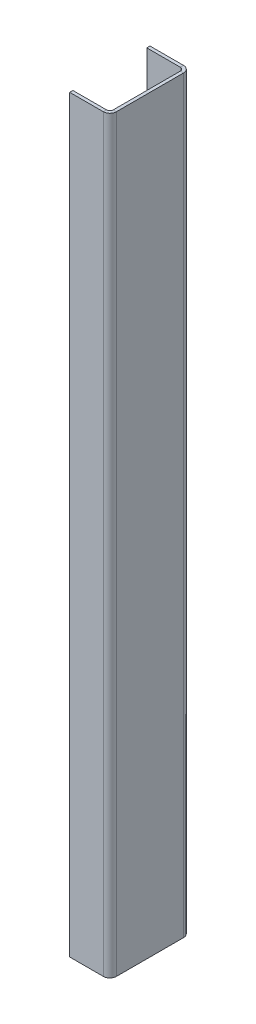
ISO-10303-21;
HEADER;
FILE_DESCRIPTION(('STEP AP214'),'2;1');
FILE_NAME('part.step','',(''),(''),'','','');
FILE_SCHEMA(('AUTOMOTIVE_DESIGN { 1 0 10303 214 1 1 1 1 }'));
ENDSEC;
DATA;
#1=APPLICATION_CONTEXT('core data for automotive mechanical design processes');
#2=APPLICATION_PROTOCOL_DEFINITION('international standard','automotive_design',2000,#1);
#3=PRODUCT_CONTEXT('',#1,'mechanical');
#4=PRODUCT('Part','Part','',(#3));
#5=PRODUCT_RELATED_PRODUCT_CATEGORY('part','',(#4));
#6=PRODUCT_DEFINITION_FORMATION('','',#4);
#7=PRODUCT_DEFINITION_CONTEXT('part definition',#1,'design');
#8=PRODUCT_DEFINITION('design','',#6,#7);
#9=PRODUCT_DEFINITION_SHAPE('','',#8);
#10=(LENGTH_UNIT() NAMED_UNIT(*) SI_UNIT(.MILLI.,.METRE.));
#11=(NAMED_UNIT(*) PLANE_ANGLE_UNIT() SI_UNIT($,.RADIAN.));
#12=(NAMED_UNIT(*) SI_UNIT($,.STERADIAN.) SOLID_ANGLE_UNIT());
#13=UNCERTAINTY_MEASURE_WITH_UNIT(LENGTH_MEASURE(1.E-05),#10,'distance_accuracy_value','');
#14=(GEOMETRIC_REPRESENTATION_CONTEXT(3) GLOBAL_UNCERTAINTY_ASSIGNED_CONTEXT((#13)) GLOBAL_UNIT_ASSIGNED_CONTEXT((#10,
#11,#12)) REPRESENTATION_CONTEXT('',''));
#15=CARTESIAN_POINT('',(0.,0.,0.));
#16=DIRECTION('',(0.,0.,1.));
#17=DIRECTION('',(1.,0.,0.));
#18=AXIS2_PLACEMENT_3D('',#15,#16,#17);
#19=CARTESIAN_POINT('',(0.,355.6,-31.88716));
#20=DIRECTION('',(0.,1.,0.));
#21=DIRECTION('',(0.,0.,1.));
#22=AXIS2_PLACEMENT_3D('',#19,#20,#21);
#23=PLANE('',#22);
#24=DIRECTION('',(-1.,0.,0.));
#25=VECTOR('',#24,1.);
#26=CARTESIAN_POINT('',(0.,355.6,-31.88716));
#27=LINE('',#26,#25);
#28=CARTESIAN_POINT('',(0.,355.6,-31.88716));
#29=VERTEX_POINT('',#28);
#30=CARTESIAN_POINT('',(-3.03784,355.6,-31.88716));
#31=VERTEX_POINT('',#30);
#32=EDGE_CURVE('E11',#29,#31,#27,.T.);
#33=ORIENTED_EDGE('',*,*,#32,.F.);
#34=CARTESIAN_POINT('',(-6.21284000000001,355.6,-31.88716));
#35=DIRECTION('',(0.,1.,0.));
#36=DIRECTION('',(0.,0.,1.));
#37=AXIS2_PLACEMENT_3D('',#34,#35,#36);
#38=CIRCLE('',#37,6.21284);
#39=CARTESIAN_POINT('',(-6.21284000000003,355.6,-38.1));
#40=VERTEX_POINT('',#39);
#41=EDGE_CURVE('E249',#40,#29,#38,.F.);
#42=ORIENTED_EDGE('',*,*,#41,.F.);
#43=DIRECTION('',(0.,0.,-1.));
#44=VECTOR('',#43,1.);
#45=CARTESIAN_POINT('',(-6.21284000000002,355.6,-35.06216));
#46=LINE('',#45,#44);
#47=CARTESIAN_POINT('',(-6.21284000000002,355.6,-35.06216));
#48=VERTEX_POINT('',#47);
#49=EDGE_CURVE('E47',#48,#40,#46,.T.);
#50=ORIENTED_EDGE('',*,*,#49,.F.);
#51=CARTESIAN_POINT('',(-6.21284000000001,355.6,-31.88716));
#52=DIRECTION('',(0.,1.,0.));
#53=DIRECTION('',(1.,0.,0.));
#54=AXIS2_PLACEMENT_3D('',#51,#52,#53);
#55=CIRCLE('',#54,3.175);
#56=EDGE_CURVE('E148',#48,#31,#55,.F.);
#57=ORIENTED_EDGE('',*,*,#56,.T.);
#58=EDGE_LOOP('',(#33,#42,#50,#57));
#59=FACE_BOUND('',#58,.T.);
#60=ADVANCED_FACE('F39',(#59),#23,.T.);
#61=CARTESIAN_POINT('',(-6.21284000000002,355.6,-35.06216));
#62=DIRECTION('',(0.,1.,0.));
#63=DIRECTION('',(0.,0.,1.));
#64=AXIS2_PLACEMENT_3D('',#61,#62,#63);
#65=PLANE('',#64);
#66=DIRECTION('',(0.,0.,1.));
#67=VECTOR('',#66,1.);
#68=CARTESIAN_POINT('',(0.,355.6,-38.1));
#69=LINE('',#68,#67);
#70=CARTESIAN_POINT('',(0.,355.6,31.8871599999999));
#71=VERTEX_POINT('',#70);
#72=EDGE_CURVE('E142',#29,#71,#69,.T.);
#73=ORIENTED_EDGE('',*,*,#72,.F.);
#74=ORIENTED_EDGE('',*,*,#32,.T.);
#75=DIRECTION('',(0.,0.,-1.));
#76=VECTOR('',#75,1.);
#77=CARTESIAN_POINT('',(-3.03784,355.6,-38.1));
#78=LINE('',#77,#76);
#79=CARTESIAN_POINT('',(-3.03784,355.6,31.88716));
#80=VERTEX_POINT('',#79);
#81=EDGE_CURVE('E139',#31,#80,#78,.F.);
#82=ORIENTED_EDGE('',*,*,#81,.T.);
#83=DIRECTION('',(1.,0.,0.));
#84=VECTOR('',#83,1.);
#85=CARTESIAN_POINT('',(-3.03784,355.6,31.88716));
#86=LINE('',#85,#84);
#87=EDGE_CURVE('E230',#80,#71,#86,.T.);
#88=ORIENTED_EDGE('',*,*,#87,.T.);
#89=EDGE_LOOP('',(#73,#74,#82,#88));
#90=FACE_BOUND('',#89,.T.);
#91=ADVANCED_FACE('F137',(#90),#65,.T.);
#92=CARTESIAN_POINT('',(-6.21284000000003,-355.6,-38.1));
#93=DIRECTION('',(0.,-1.,0.));
#94=DIRECTION('',(0.,0.,-1.));
#95=AXIS2_PLACEMENT_3D('',#92,#93,#94);
#96=PLANE('',#95);
#97=DIRECTION('',(0.,0.,1.));
#98=VECTOR('',#97,1.);
#99=CARTESIAN_POINT('',(-6.21284000000003,-355.6,-38.1));
#100=LINE('',#99,#98);
#101=CARTESIAN_POINT('',(-6.21284000000003,-355.6,-38.1));
#102=VERTEX_POINT('',#101);
#103=CARTESIAN_POINT('',(-6.21284000000002,-355.6,-35.06216));
#104=VERTEX_POINT('',#103);
#105=EDGE_CURVE('E235',#102,#104,#100,.T.);
#106=ORIENTED_EDGE('',*,*,#105,.F.);
#107=CARTESIAN_POINT('',(-6.21284000000001,-355.6,-31.88716));
#108=DIRECTION('',(0.,1.,0.));
#109=DIRECTION('',(0.,0.,1.));
#110=AXIS2_PLACEMENT_3D('',#107,#108,#109);
#111=CIRCLE('',#110,6.21284);
#112=CARTESIAN_POINT('',(0.,-355.6,-31.88716));
#113=VERTEX_POINT('',#112);
#114=EDGE_CURVE('E187',#102,#113,#111,.F.);
#115=ORIENTED_EDGE('',*,*,#114,.T.);
#116=DIRECTION('',(1.,0.,0.));
#117=VECTOR('',#116,1.);
#118=CARTESIAN_POINT('',(-3.03784,-355.6,-31.88716));
#119=LINE('',#118,#117);
#120=CARTESIAN_POINT('',(-3.03784,-355.6,-31.88716));
#121=VERTEX_POINT('',#120);
#122=EDGE_CURVE('E233',#121,#113,#119,.T.);
#123=ORIENTED_EDGE('',*,*,#122,.F.);
#124=CARTESIAN_POINT('',(-6.21284000000001,-355.6,-31.88716));
#125=DIRECTION('',(0.,1.,0.));
#126=DIRECTION('',(1.,0.,0.));
#127=AXIS2_PLACEMENT_3D('',#124,#125,#126);
#128=CIRCLE('',#127,3.175);
#129=EDGE_CURVE('E160',#104,#121,#128,.F.);
#130=ORIENTED_EDGE('',*,*,#129,.F.);
#131=EDGE_LOOP('',(#106,#115,#123,#130));
#132=FACE_BOUND('',#131,.T.);
#133=ADVANCED_FACE('F287',(#132),#96,.T.);
#134=CARTESIAN_POINT('',(-3.03784,-355.6,-31.88716));
#135=DIRECTION('',(0.,-1.,0.));
#136=DIRECTION('',(0.,0.,-1.));
#137=AXIS2_PLACEMENT_3D('',#134,#135,#136);
#138=PLANE('',#137);
#139=DIRECTION('',(1.,0.,0.));
#140=VECTOR('',#139,1.);
#141=CARTESIAN_POINT('',(-38.1,-355.6,-38.1));
#142=LINE('',#141,#140);
#143=CARTESIAN_POINT('',(-38.1,-355.6,-38.1));
#144=VERTEX_POINT('',#143);
#145=EDGE_CURVE('E190',#144,#102,#142,.T.);
#146=ORIENTED_EDGE('',*,*,#145,.T.);
#147=ORIENTED_EDGE('',*,*,#105,.T.);
#148=DIRECTION('',(1.,0.,0.));
#149=VECTOR('',#148,1.);
#150=CARTESIAN_POINT('',(-38.1,-355.6,-35.06216));
#151=LINE('',#150,#149);
#152=CARTESIAN_POINT('',(-38.1,-355.6,-35.06216));
#153=VERTEX_POINT('',#152);
#154=EDGE_CURVE('E196',#153,#104,#151,.T.);
#155=ORIENTED_EDGE('',*,*,#154,.F.);
#156=DIRECTION('',(0.,0.,-1.));
#157=VECTOR('',#156,1.);
#158=CARTESIAN_POINT('',(-38.1,-355.6,-35.06216));
#159=LINE('',#158,#157);
#160=EDGE_CURVE('E193',#153,#144,#159,.T.);
#161=ORIENTED_EDGE('',*,*,#160,.T.);
#162=EDGE_LOOP('',(#146,#147,#155,#161));
#163=FACE_BOUND('',#162,.T.);
#164=ADVANCED_FACE('F290',(#163),#138,.T.);
#165=CARTESIAN_POINT('',(-6.21284,355.6,38.1));
#166=DIRECTION('',(0.,1.,0.));
#167=DIRECTION('',(0.,0.,1.));
#168=AXIS2_PLACEMENT_3D('',#165,#166,#167);
#169=PLANE('',#168);
#170=DIRECTION('',(0.,0.,-1.));
#171=VECTOR('',#170,1.);
#172=CARTESIAN_POINT('',(-6.21284,355.6,38.1));
#173=LINE('',#172,#171);
#174=CARTESIAN_POINT('',(-6.21284,355.6,38.1));
#175=VERTEX_POINT('',#174);
#176=CARTESIAN_POINT('',(-6.21284,355.6,35.06216));
#177=VERTEX_POINT('',#176);
#178=EDGE_CURVE('E55',#175,#177,#173,.T.);
#179=ORIENTED_EDGE('',*,*,#178,.F.);
#180=CARTESIAN_POINT('',(-6.21284,355.6,31.88716));
#181=DIRECTION('',(0.,1.,0.));
#182=DIRECTION('',(0.,0.,1.));
#183=AXIS2_PLACEMENT_3D('',#180,#181,#182);
#184=CIRCLE('',#183,6.21284);
#185=EDGE_CURVE('E259',#71,#175,#184,.F.);
#186=ORIENTED_EDGE('',*,*,#185,.F.);
#187=ORIENTED_EDGE('',*,*,#87,.F.);
#188=CARTESIAN_POINT('',(-6.21284,355.6,31.88716));
#189=DIRECTION('',(0.,1.,0.));
#190=DIRECTION('',(1.,0.,0.));
#191=AXIS2_PLACEMENT_3D('',#188,#189,#190);
#192=CIRCLE('',#191,3.175);
#193=EDGE_CURVE('E168',#80,#177,#192,.F.);
#194=ORIENTED_EDGE('',*,*,#193,.T.);
#195=EDGE_LOOP('',(#179,#186,#187,#194));
#196=FACE_BOUND('',#195,.T.);
#197=ADVANCED_FACE('F282',(#196),#169,.T.);
#198=CARTESIAN_POINT('',(-3.03784,355.6,31.88716));
#199=DIRECTION('',(0.,1.,0.));
#200=DIRECTION('',(0.,0.,1.));
#201=AXIS2_PLACEMENT_3D('',#198,#199,#200);
#202=PLANE('',#201);
#203=DIRECTION('',(-1.,0.,0.));
#204=VECTOR('',#203,1.);
#205=CARTESIAN_POINT('',(0.,355.6,38.1));
#206=LINE('',#205,#204);
#207=CARTESIAN_POINT('',(-38.1,355.6,38.1));
#208=VERTEX_POINT('',#207);
#209=EDGE_CURVE('E262',#175,#208,#206,.T.);
#210=ORIENTED_EDGE('',*,*,#209,.F.);
#211=ORIENTED_EDGE('',*,*,#178,.T.);
#212=DIRECTION('',(1.,0.,0.));
#213=VECTOR('',#212,1.);
#214=CARTESIAN_POINT('',(0.,355.6,35.06216));
#215=LINE('',#214,#213);
#216=CARTESIAN_POINT('',(-38.1,355.6,35.06216));
#217=VERTEX_POINT('',#216);
#218=EDGE_CURVE('E109',#177,#217,#215,.F.);
#219=ORIENTED_EDGE('',*,*,#218,.T.);
#220=DIRECTION('',(0.,0.,-1.));
#221=VECTOR('',#220,1.);
#222=CARTESIAN_POINT('',(-38.1,355.6,38.1));
#223=LINE('',#222,#221);
#224=EDGE_CURVE('E265',#208,#217,#223,.T.);
#225=ORIENTED_EDGE('',*,*,#224,.F.);
#226=EDGE_LOOP('',(#210,#211,#219,#225));
#227=FACE_BOUND('',#226,.T.);
#228=ADVANCED_FACE('F271',(#227),#202,.T.);
#229=CARTESIAN_POINT('',(0.,-355.6,31.8871599999999));
#230=DIRECTION('',(0.,-1.,0.));
#231=DIRECTION('',(0.,0.,-1.));
#232=AXIS2_PLACEMENT_3D('',#229,#230,#231);
#233=PLANE('',#232);
#234=DIRECTION('',(-1.,0.,0.));
#235=VECTOR('',#234,1.);
#236=CARTESIAN_POINT('',(0.,-355.6,31.8871599999999));
#237=LINE('',#236,#235);
#238=CARTESIAN_POINT('',(0.,-355.6,31.8871599999999));
#239=VERTEX_POINT('',#238);
#240=CARTESIAN_POINT('',(-3.03784,-355.6,31.88716));
#241=VERTEX_POINT('',#240);
#242=EDGE_CURVE('E96',#239,#241,#237,.T.);
#243=ORIENTED_EDGE('',*,*,#242,.F.);
#244=CARTESIAN_POINT('',(-6.21284,-355.6,31.88716));
#245=DIRECTION('',(0.,1.,0.));
#246=DIRECTION('',(0.,0.,1.));
#247=AXIS2_PLACEMENT_3D('',#244,#245,#246);
#248=CIRCLE('',#247,6.21284);
#249=CARTESIAN_POINT('',(-6.21284,-355.6,38.1));
#250=VERTEX_POINT('',#249);
#251=EDGE_CURVE('E183',#239,#250,#248,.F.);
#252=ORIENTED_EDGE('',*,*,#251,.T.);
#253=DIRECTION('',(0.,0.,1.));
#254=VECTOR('',#253,1.);
#255=CARTESIAN_POINT('',(-6.21284,-355.6,35.06216));
#256=LINE('',#255,#254);
#257=CARTESIAN_POINT('',(-6.21284,-355.6,35.06216));
#258=VERTEX_POINT('',#257);
#259=EDGE_CURVE('E103',#258,#250,#256,.T.);
#260=ORIENTED_EDGE('',*,*,#259,.F.);
#261=CARTESIAN_POINT('',(-6.21284,-355.6,31.88716));
#262=DIRECTION('',(0.,1.,0.));
#263=DIRECTION('',(1.,0.,0.));
#264=AXIS2_PLACEMENT_3D('',#261,#262,#263);
#265=CIRCLE('',#264,3.175);
#266=EDGE_CURVE('E202',#241,#258,#265,.F.);
#267=ORIENTED_EDGE('',*,*,#266,.F.);
#268=EDGE_LOOP('',(#243,#252,#260,#267));
#269=FACE_BOUND('',#268,.T.);
#270=ADVANCED_FACE('F319',(#269),#233,.T.);
#271=CARTESIAN_POINT('',(-6.21284,-355.6,35.06216));
#272=DIRECTION('',(0.,-1.,0.));
#273=DIRECTION('',(0.,0.,-1.));
#274=AXIS2_PLACEMENT_3D('',#271,#272,#273);
#275=PLANE('',#274);
#276=DIRECTION('',(0.,0.,1.));
#277=VECTOR('',#276,1.);
#278=CARTESIAN_POINT('',(0.,-355.6,-38.1));
#279=LINE('',#278,#277);
#280=EDGE_CURVE('E185',#113,#239,#279,.T.);
#281=ORIENTED_EDGE('',*,*,#280,.T.);
#282=ORIENTED_EDGE('',*,*,#242,.T.);
#283=DIRECTION('',(0.,0.,-1.));
#284=VECTOR('',#283,1.);
#285=CARTESIAN_POINT('',(-3.03784,-355.6,-38.1));
#286=LINE('',#285,#284);
#287=EDGE_CURVE('E200',#121,#241,#286,.F.);
#288=ORIENTED_EDGE('',*,*,#287,.F.);
#289=ORIENTED_EDGE('',*,*,#122,.T.);
#290=EDGE_LOOP('',(#281,#282,#288,#289));
#291=FACE_BOUND('',#290,.T.);
#292=ADVANCED_FACE('F322',(#291),#275,.T.);
#293=CARTESIAN_POINT('',(0.,355.6,35.06216));
#294=DIRECTION('',(0.,0.,1.));
#295=DIRECTION('',(1.,0.,0.));
#296=AXIS2_PLACEMENT_3D('',#293,#294,#295);
#297=PLANE('',#296);
#298=DIRECTION('',(1.,0.,0.));
#299=VECTOR('',#298,1.);
#300=CARTESIAN_POINT('',(0.,-355.6,35.06216));
#301=LINE('',#300,#299);
#302=CARTESIAN_POINT('',(-38.1,-355.6,35.06216));
#303=VERTEX_POINT('',#302);
#304=EDGE_CURVE('E174',#258,#303,#301,.F.);
#305=ORIENTED_EDGE('',*,*,#304,.T.);
#306=DIRECTION('',(0.,-1.,0.));
#307=VECTOR('',#306,1.);
#308=CARTESIAN_POINT('',(-38.1,355.6,35.06216));
#309=LINE('',#308,#307);
#310=EDGE_CURVE('E226',#217,#303,#309,.T.);
#311=ORIENTED_EDGE('',*,*,#310,.F.);
#312=ORIENTED_EDGE('',*,*,#218,.F.);
#313=DIRECTION('',(0.,-1.,0.));
#314=VECTOR('',#313,1.);
#315=CARTESIAN_POINT('',(-6.21284,355.6,35.06216));
#316=LINE('',#315,#314);
#317=EDGE_CURVE('E170',#177,#258,#316,.T.);
#318=ORIENTED_EDGE('',*,*,#317,.T.);
#319=EDGE_LOOP('',(#305,#311,#312,#318));
#320=FACE_BOUND('',#319,.T.);
#321=ADVANCED_FACE('F325',(#320),#297,.F.);
#322=CARTESIAN_POINT('',(-38.1,355.6,38.1));
#323=DIRECTION('',(-1.,0.,0.));
#324=DIRECTION('',(0.,0.,1.));
#325=AXIS2_PLACEMENT_3D('',#322,#323,#324);
#326=PLANE('',#325);
#327=DIRECTION('',(0.,0.,-1.));
#328=VECTOR('',#327,1.);
#329=CARTESIAN_POINT('',(-38.1,-355.6,38.1));
#330=LINE('',#329,#328);
#331=CARTESIAN_POINT('',(-38.1,-355.6,38.1));
#332=VERTEX_POINT('',#331);
#333=EDGE_CURVE('E177',#332,#303,#330,.T.);
#334=ORIENTED_EDGE('',*,*,#333,.F.);
#335=DIRECTION('',(0.,-1.,0.));
#336=VECTOR('',#335,1.);
#337=CARTESIAN_POINT('',(-38.1,355.6,38.1));
#338=LINE('',#337,#336);
#339=EDGE_CURVE('E224',#208,#332,#338,.T.);
#340=ORIENTED_EDGE('',*,*,#339,.F.);
#341=ORIENTED_EDGE('',*,*,#224,.T.);
#342=ORIENTED_EDGE('',*,*,#310,.T.);
#343=EDGE_LOOP('',(#334,#340,#341,#342));
#344=FACE_BOUND('',#343,.T.);
#345=ADVANCED_FACE('F270',(#344),#326,.T.);
#346=CARTESIAN_POINT('',(0.,355.6,38.1));
#347=DIRECTION('',(0.,0.,1.));
#348=DIRECTION('',(1.,0.,0.));
#349=AXIS2_PLACEMENT_3D('',#346,#347,#348);
#350=PLANE('',#349);
#351=DIRECTION('',(-1.,0.,0.));
#352=VECTOR('',#351,1.);
#353=CARTESIAN_POINT('',(0.,-355.6,38.1));
#354=LINE('',#353,#352);
#355=EDGE_CURVE('E180',#250,#332,#354,.T.);
#356=ORIENTED_EDGE('',*,*,#355,.F.);
#357=DIRECTION('',(0.,-1.,0.));
#358=VECTOR('',#357,1.);
#359=CARTESIAN_POINT('',(-6.21284,355.6,38.1));
#360=LINE('',#359,#358);
#361=EDGE_CURVE('E221',#175,#250,#360,.T.);
#362=ORIENTED_EDGE('',*,*,#361,.F.);
#363=ORIENTED_EDGE('',*,*,#209,.T.);
#364=ORIENTED_EDGE('',*,*,#339,.T.);
#365=EDGE_LOOP('',(#356,#362,#363,#364));
#366=FACE_BOUND('',#365,.T.);
#367=ADVANCED_FACE('F275',(#366),#350,.T.);
#368=CARTESIAN_POINT('',(-6.21284,355.6,31.88716));
#369=DIRECTION('',(0.,-1.,0.));
#370=DIRECTION('',(0.,0.,-1.));
#371=AXIS2_PLACEMENT_3D('',#368,#369,#370);
#372=CYLINDRICAL_SURFACE('',#371,6.21284);
#373=ORIENTED_EDGE('',*,*,#251,.F.);
#374=DIRECTION('',(0.,-1.,0.));
#375=VECTOR('',#374,1.);
#376=CARTESIAN_POINT('',(0.,355.6,31.8871599999999));
#377=LINE('',#376,#375);
#378=EDGE_CURVE('E218',#71,#239,#377,.T.);
#379=ORIENTED_EDGE('',*,*,#378,.F.);
#380=ORIENTED_EDGE('',*,*,#185,.T.);
#381=ORIENTED_EDGE('',*,*,#361,.T.);
#382=EDGE_LOOP('',(#373,#379,#380,#381));
#383=FACE_BOUND('',#382,.T.);
#384=ADVANCED_FACE('F278',(#383),#372,.T.);
#385=CARTESIAN_POINT('',(0.,355.6,-38.1));
#386=DIRECTION('',(1.,0.,0.));
#387=DIRECTION('',(0.,0.,-1.));
#388=AXIS2_PLACEMENT_3D('',#385,#386,#387);
#389=PLANE('',#388);
#390=ORIENTED_EDGE('',*,*,#280,.F.);
#391=DIRECTION('',(0.,-1.,0.));
#392=VECTOR('',#391,1.);
#393=CARTESIAN_POINT('',(0.,355.6,-31.88716));
#394=LINE('',#393,#392);
#395=EDGE_CURVE('E215',#29,#113,#394,.T.);
#396=ORIENTED_EDGE('',*,*,#395,.F.);
#397=ORIENTED_EDGE('',*,*,#72,.T.);
#398=ORIENTED_EDGE('',*,*,#378,.T.);
#399=EDGE_LOOP('',(#390,#396,#397,#398));
#400=FACE_BOUND('',#399,.T.);
#401=ADVANCED_FACE('F285',(#400),#389,.T.);
#402=CARTESIAN_POINT('',(-6.21284000000001,355.6,-31.88716));
#403=DIRECTION('',(0.,-1.,0.));
#404=DIRECTION('',(0.,0.,-1.));
#405=AXIS2_PLACEMENT_3D('',#402,#403,#404);
#406=CYLINDRICAL_SURFACE('',#405,6.21284);
#407=ORIENTED_EDGE('',*,*,#114,.F.);
#408=DIRECTION('',(0.,-1.,0.));
#409=VECTOR('',#408,1.);
#410=CARTESIAN_POINT('',(-6.21284000000003,355.6,-38.1));
#411=LINE('',#410,#409);
#412=EDGE_CURVE('E212',#40,#102,#411,.T.);
#413=ORIENTED_EDGE('',*,*,#412,.F.);
#414=ORIENTED_EDGE('',*,*,#41,.T.);
#415=ORIENTED_EDGE('',*,*,#395,.T.);
#416=EDGE_LOOP('',(#407,#413,#414,#415));
#417=FACE_BOUND('',#416,.T.);
#418=ADVANCED_FACE('F248',(#417),#406,.T.);
#419=CARTESIAN_POINT('',(-38.1,355.6,-38.1));
#420=DIRECTION('',(0.,0.,-1.));
#421=DIRECTION('',(-1.,0.,0.));
#422=AXIS2_PLACEMENT_3D('',#419,#420,#421);
#423=PLANE('',#422);
#424=ORIENTED_EDGE('',*,*,#145,.F.);
#425=DIRECTION('',(0.,-1.,0.));
#426=VECTOR('',#425,1.);
#427=CARTESIAN_POINT('',(-38.1,355.6,-38.1));
#428=LINE('',#427,#426);
#429=CARTESIAN_POINT('',(-38.1,355.6,-38.1));
#430=VERTEX_POINT('',#429);
#431=EDGE_CURVE('E210',#430,#144,#428,.T.);
#432=ORIENTED_EDGE('',*,*,#431,.F.);
#433=DIRECTION('',(1.,0.,0.));
#434=VECTOR('',#433,1.);
#435=CARTESIAN_POINT('',(-38.1,355.6,-38.1));
#436=LINE('',#435,#434);
#437=EDGE_CURVE('E242',#430,#40,#436,.T.);
#438=ORIENTED_EDGE('',*,*,#437,.T.);
#439=ORIENTED_EDGE('',*,*,#412,.T.);
#440=EDGE_LOOP('',(#424,#432,#438,#439));
#441=FACE_BOUND('',#440,.T.);
#442=ADVANCED_FACE('F253',(#441),#423,.T.);
#443=CARTESIAN_POINT('',(-38.1,355.6,-35.06216));
#444=DIRECTION('',(-1.,0.,0.));
#445=DIRECTION('',(0.,0.,1.));
#446=AXIS2_PLACEMENT_3D('',#443,#444,#445);
#447=PLANE('',#446);
#448=ORIENTED_EDGE('',*,*,#160,.F.);
#449=DIRECTION('',(0.,-1.,0.));
#450=VECTOR('',#449,1.);
#451=CARTESIAN_POINT('',(-38.1,355.6,-35.06216));
#452=LINE('',#451,#450);
#453=CARTESIAN_POINT('',(-38.1,355.6,-35.06216));
#454=VERTEX_POINT('',#453);
#455=EDGE_CURVE('E208',#454,#153,#452,.T.);
#456=ORIENTED_EDGE('',*,*,#455,.F.);
#457=DIRECTION('',(0.,0.,-1.));
#458=VECTOR('',#457,1.);
#459=CARTESIAN_POINT('',(-38.1,355.6,-35.06216));
#460=LINE('',#459,#458);
#461=EDGE_CURVE('E254',#454,#430,#460,.T.);
#462=ORIENTED_EDGE('',*,*,#461,.T.);
#463=ORIENTED_EDGE('',*,*,#431,.T.);
#464=EDGE_LOOP('',(#448,#456,#462,#463));
#465=FACE_BOUND('',#464,.T.);
#466=ADVANCED_FACE('F295',(#465),#447,.T.);
#467=CARTESIAN_POINT('',(-38.1,355.6,-35.06216));
#468=DIRECTION('',(0.,0.,-1.));
#469=DIRECTION('',(-1.,0.,0.));
#470=AXIS2_PLACEMENT_3D('',#467,#468,#469);
#471=PLANE('',#470);
#472=ORIENTED_EDGE('',*,*,#154,.T.);
#473=DIRECTION('',(0.,-1.,0.));
#474=VECTOR('',#473,1.);
#475=CARTESIAN_POINT('',(-6.21284000000002,355.6,-35.06216));
#476=LINE('',#475,#474);
#477=EDGE_CURVE('E162',#48,#104,#476,.T.);
#478=ORIENTED_EDGE('',*,*,#477,.F.);
#479=DIRECTION('',(1.,0.,0.));
#480=VECTOR('',#479,1.);
#481=CARTESIAN_POINT('',(-38.1,355.6,-35.06216));
#482=LINE('',#481,#480);
#483=EDGE_CURVE('E153',#454,#48,#482,.T.);
#484=ORIENTED_EDGE('',*,*,#483,.F.);
#485=ORIENTED_EDGE('',*,*,#455,.T.);
#486=EDGE_LOOP('',(#472,#478,#484,#485));
#487=FACE_BOUND('',#486,.T.);
#488=ADVANCED_FACE('F293',(#487),#471,.F.);
#489=CARTESIAN_POINT('',(-6.21284000000001,355.6,-31.88716));
#490=DIRECTION('',(0.,-1.,0.));
#491=DIRECTION('',(0.,0.,-1.));
#492=AXIS2_PLACEMENT_3D('',#489,#490,#491);
#493=CYLINDRICAL_SURFACE('',#492,3.175);
#494=ORIENTED_EDGE('',*,*,#129,.T.);
#495=DIRECTION('',(0.,-1.,0.));
#496=VECTOR('',#495,1.);
#497=CARTESIAN_POINT('',(-3.03784,355.6,-31.88716));
#498=LINE('',#497,#496);
#499=EDGE_CURVE('E157',#31,#121,#498,.T.);
#500=ORIENTED_EDGE('',*,*,#499,.F.);
#501=ORIENTED_EDGE('',*,*,#56,.F.);
#502=ORIENTED_EDGE('',*,*,#477,.T.);
#503=EDGE_LOOP('',(#494,#500,#501,#502));
#504=FACE_BOUND('',#503,.T.);
#505=ADVANCED_FACE('F158',(#504),#493,.F.);
#506=CARTESIAN_POINT('',(-3.03784,355.6,-38.1));
#507=DIRECTION('',(1.,0.,0.));
#508=DIRECTION('',(0.,0.,-1.));
#509=AXIS2_PLACEMENT_3D('',#506,#507,#508);
#510=PLANE('',#509);
#511=ORIENTED_EDGE('',*,*,#287,.T.);
#512=DIRECTION('',(0.,-1.,0.));
#513=VECTOR('',#512,1.);
#514=CARTESIAN_POINT('',(-3.03784,355.6,31.88716));
#515=LINE('',#514,#513);
#516=EDGE_CURVE('E163',#80,#241,#515,.T.);
#517=ORIENTED_EDGE('',*,*,#516,.F.);
#518=ORIENTED_EDGE('',*,*,#81,.F.);
#519=ORIENTED_EDGE('',*,*,#499,.T.);
#520=EDGE_LOOP('',(#511,#517,#518,#519));
#521=FACE_BOUND('',#520,.T.);
#522=ADVANCED_FACE('F165',(#521),#510,.F.);
#523=CARTESIAN_POINT('',(-6.21284,355.6,31.88716));
#524=DIRECTION('',(0.,-1.,0.));
#525=DIRECTION('',(0.,0.,-1.));
#526=AXIS2_PLACEMENT_3D('',#523,#524,#525);
#527=CYLINDRICAL_SURFACE('',#526,3.175);
#528=ORIENTED_EDGE('',*,*,#266,.T.);
#529=ORIENTED_EDGE('',*,*,#317,.F.);
#530=ORIENTED_EDGE('',*,*,#193,.F.);
#531=ORIENTED_EDGE('',*,*,#516,.T.);
#532=EDGE_LOOP('',(#528,#529,#530,#531));
#533=FACE_BOUND('',#532,.T.);
#534=ADVANCED_FACE('F377',(#533),#527,.F.);
#535=CARTESIAN_POINT('',(-6.21284,355.6,31.88716));
#536=DIRECTION('',(0.,1.,0.));
#537=DIRECTION('',(1.,0.,0.));
#538=AXIS2_PLACEMENT_3D('',#535,#536,#537);
#539=PLANE('',#538);
#540=ORIENTED_EDGE('',*,*,#483,.T.);
#541=ORIENTED_EDGE('',*,*,#49,.T.);
#542=ORIENTED_EDGE('',*,*,#437,.F.);
#543=ORIENTED_EDGE('',*,*,#461,.F.);
#544=EDGE_LOOP('',(#540,#541,#542,#543));
#545=FACE_BOUND('',#544,.T.);
#546=ADVANCED_FACE('F239',(#545),#539,.T.);
#547=CARTESIAN_POINT('',(-6.21284,-355.6,31.88716));
#548=DIRECTION('',(0.,1.,0.));
#549=DIRECTION('',(1.,0.,0.));
#550=AXIS2_PLACEMENT_3D('',#547,#548,#549);
#551=PLANE('',#550);
#552=ORIENTED_EDGE('',*,*,#304,.F.);
#553=ORIENTED_EDGE('',*,*,#259,.T.);
#554=ORIENTED_EDGE('',*,*,#355,.T.);
#555=ORIENTED_EDGE('',*,*,#333,.T.);
#556=EDGE_LOOP('',(#552,#553,#554,#555));
#557=FACE_BOUND('',#556,.T.);
#558=ADVANCED_FACE('F397',(#557),#551,.F.);
#559=CLOSED_SHELL('',(#60,#91,#133,#164,#197,#228,#270,#292,#321,#345,#367,#384,#401,#418,#442,
#466,#488,#505,#522,#534,#546,#558));
#560=MANIFOLD_SOLID_BREP('B2',#559);
#561=ADVANCED_BREP_SHAPE_REPRESENTATION('',(#18,#560),#14);
#562=SHAPE_DEFINITION_REPRESENTATION(#9,#561);
ENDSEC;
END-ISO-10303-21;
